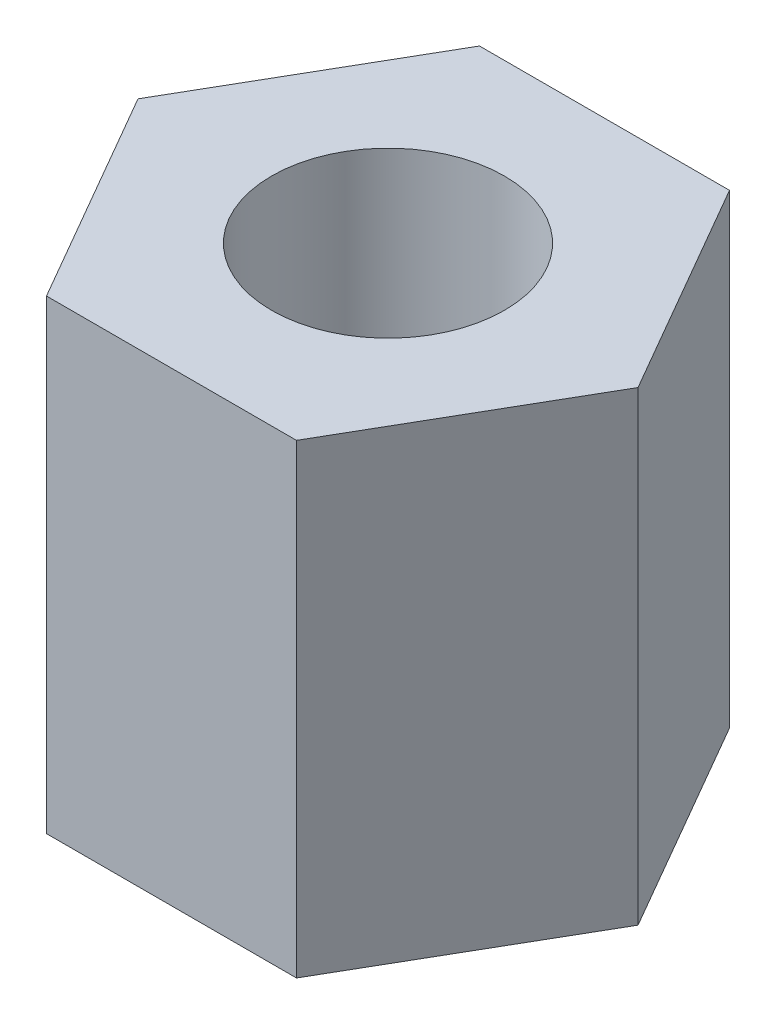
ISO-10303-21;
HEADER;
FILE_DESCRIPTION(('STEP AP214'),'2;1');
FILE_NAME('part.step','',(''),(''),'','','');
FILE_SCHEMA(('AUTOMOTIVE_DESIGN { 1 0 10303 214 1 1 1 1 }'));
ENDSEC;
DATA;
#1=APPLICATION_CONTEXT('core data for automotive mechanical design processes');
#2=APPLICATION_PROTOCOL_DEFINITION('international standard','automotive_design',2000,#1);
#3=PRODUCT_CONTEXT('',#1,'mechanical');
#4=PRODUCT('Part','Part','',(#3));
#5=PRODUCT_RELATED_PRODUCT_CATEGORY('part','',(#4));
#6=PRODUCT_DEFINITION_FORMATION('','',#4);
#7=PRODUCT_DEFINITION_CONTEXT('part definition',#1,'design');
#8=PRODUCT_DEFINITION('design','',#6,#7);
#9=PRODUCT_DEFINITION_SHAPE('','',#8);
#10=(LENGTH_UNIT() NAMED_UNIT(*) SI_UNIT(.MILLI.,.METRE.));
#11=(NAMED_UNIT(*) PLANE_ANGLE_UNIT() SI_UNIT($,.RADIAN.));
#12=(NAMED_UNIT(*) SI_UNIT($,.STERADIAN.) SOLID_ANGLE_UNIT());
#13=UNCERTAINTY_MEASURE_WITH_UNIT(LENGTH_MEASURE(1.E-05),#10,'distance_accuracy_value','');
#14=(GEOMETRIC_REPRESENTATION_CONTEXT(3) GLOBAL_UNCERTAINTY_ASSIGNED_CONTEXT((#13)) GLOBAL_UNIT_ASSIGNED_CONTEXT((#10,
#11,#12)) REPRESENTATION_CONTEXT('',''));
#15=CARTESIAN_POINT('',(0.,0.,0.));
#16=DIRECTION('',(0.,0.,1.));
#17=DIRECTION('',(1.,0.,0.));
#18=AXIS2_PLACEMENT_3D('',#15,#16,#17);
#19=CARTESIAN_POINT('',(1.34233937586591,2.5,2.32499999999999));
#20=DIRECTION('',(-0.866025403784442,0.,-0.499999999999995));
#21=DIRECTION('',(-0.499999999999995,0.,0.866025403784442));
#22=AXIS2_PLACEMENT_3D('',#19,#20,#21);
#23=PLANE('',#22);
#24=DIRECTION('',(0.499999999999995,0.,-0.866025403784442));
#25=VECTOR('',#24,1.);
#26=CARTESIAN_POINT('',(1.34233937586591,-2.5,2.32499999999999));
#27=LINE('',#26,#25);
#28=CARTESIAN_POINT('',(1.34233937586591,-2.5,2.32499999999999));
#29=VERTEX_POINT('',#28);
#30=CARTESIAN_POINT('',(2.68467875173176,-2.5,0.));
#31=VERTEX_POINT('',#30);
#32=EDGE_CURVE('E120',#29,#31,#27,.T.);
#33=ORIENTED_EDGE('',*,*,#32,.T.);
#34=DIRECTION('',(0.,-1.,0.));
#35=VECTOR('',#34,1.);
#36=CARTESIAN_POINT('',(2.68467875173176,2.5,0.));
#37=LINE('',#36,#35);
#38=CARTESIAN_POINT('',(2.68467875173176,2.5,0.));
#39=VERTEX_POINT('',#38);
#40=EDGE_CURVE('E11',#39,#31,#37,.T.);
#41=ORIENTED_EDGE('',*,*,#40,.F.);
#42=DIRECTION('',(0.499999999999995,0.,-0.866025403784442));
#43=VECTOR('',#42,1.);
#44=CARTESIAN_POINT('',(1.34233937586591,2.5,2.32499999999999));
#45=LINE('',#44,#43);
#46=CARTESIAN_POINT('',(1.34233937586591,2.5,2.32499999999999));
#47=VERTEX_POINT('',#46);
#48=EDGE_CURVE('E131',#47,#39,#45,.T.);
#49=ORIENTED_EDGE('',*,*,#48,.F.);
#50=DIRECTION('',(0.,-1.,0.));
#51=VECTOR('',#50,1.);
#52=CARTESIAN_POINT('',(1.34233937586591,2.5,2.32499999999999));
#53=LINE('',#52,#51);
#54=EDGE_CURVE('E116',#47,#29,#53,.T.);
#55=ORIENTED_EDGE('',*,*,#54,.T.);
#56=EDGE_LOOP('',(#33,#41,#49,#55));
#57=FACE_BOUND('',#56,.T.);
#58=ADVANCED_FACE('F36',(#57),#23,.F.);
#59=CARTESIAN_POINT('',(2.68467875173176,2.5,0.));
#60=DIRECTION('',(-0.866025403784438,0.,0.500000000000001));
#61=DIRECTION('',(0.500000000000001,0.,0.866025403784438));
#62=AXIS2_PLACEMENT_3D('',#59,#60,#61);
#63=PLANE('',#62);
#64=DIRECTION('',(-0.500000000000001,0.,-0.866025403784438));
#65=VECTOR('',#64,1.);
#66=CARTESIAN_POINT('',(2.68467875173176,-2.5,0.));
#67=LINE('',#66,#65);
#68=CARTESIAN_POINT('',(1.34233937586588,-2.5,-2.325));
#69=VERTEX_POINT('',#68);
#70=EDGE_CURVE('E123',#31,#69,#67,.T.);
#71=ORIENTED_EDGE('',*,*,#70,.T.);
#72=DIRECTION('',(0.,-1.,0.));
#73=VECTOR('',#72,1.);
#74=CARTESIAN_POINT('',(1.34233937586588,2.5,-2.325));
#75=LINE('',#74,#73);
#76=CARTESIAN_POINT('',(1.34233937586588,2.5,-2.325));
#77=VERTEX_POINT('',#76);
#78=EDGE_CURVE('E44',#77,#69,#75,.T.);
#79=ORIENTED_EDGE('',*,*,#78,.F.);
#80=DIRECTION('',(-0.500000000000001,0.,-0.866025403784438));
#81=VECTOR('',#80,1.);
#82=CARTESIAN_POINT('',(2.68467875173176,2.5,0.));
#83=LINE('',#82,#81);
#84=EDGE_CURVE('E89',#39,#77,#83,.T.);
#85=ORIENTED_EDGE('',*,*,#84,.F.);
#86=ORIENTED_EDGE('',*,*,#40,.T.);
#87=EDGE_LOOP('',(#71,#79,#85,#86));
#88=FACE_BOUND('',#87,.T.);
#89=ADVANCED_FACE('F156',(#88),#63,.F.);
#90=CARTESIAN_POINT('',(1.34233937586588,2.5,-2.325));
#91=DIRECTION('',(0.,0.,1.));
#92=DIRECTION('',(1.,0.,0.));
#93=AXIS2_PLACEMENT_3D('',#90,#91,#92);
#94=PLANE('',#93);
#95=DIRECTION('',(-1.,0.,0.));
#96=VECTOR('',#95,1.);
#97=CARTESIAN_POINT('',(1.34233937586588,-2.5,-2.325));
#98=LINE('',#97,#96);
#99=CARTESIAN_POINT('',(-1.34233937586589,-2.5,-2.32499999999999));
#100=VERTEX_POINT('',#99);
#101=EDGE_CURVE('E126',#69,#100,#98,.T.);
#102=ORIENTED_EDGE('',*,*,#101,.T.);
#103=DIRECTION('',(0.,-1.,0.));
#104=VECTOR('',#103,1.);
#105=CARTESIAN_POINT('',(-1.34233937586589,2.5,-2.32499999999999));
#106=LINE('',#105,#104);
#107=CARTESIAN_POINT('',(-1.34233937586589,2.5,-2.32499999999999));
#108=VERTEX_POINT('',#107);
#109=EDGE_CURVE('E111',#108,#100,#106,.T.);
#110=ORIENTED_EDGE('',*,*,#109,.F.);
#111=DIRECTION('',(-1.,0.,0.));
#112=VECTOR('',#111,1.);
#113=CARTESIAN_POINT('',(1.34233937586588,2.5,-2.325));
#114=LINE('',#113,#112);
#115=EDGE_CURVE('E102',#77,#108,#114,.T.);
#116=ORIENTED_EDGE('',*,*,#115,.F.);
#117=ORIENTED_EDGE('',*,*,#78,.T.);
#118=EDGE_LOOP('',(#102,#110,#116,#117));
#119=FACE_BOUND('',#118,.T.);
#120=ADVANCED_FACE('F137',(#119),#94,.F.);
#121=CARTESIAN_POINT('',(-1.34233937586589,2.5,-2.32499999999999));
#122=DIRECTION('',(0.866025403784441,0.,0.499999999999995));
#123=DIRECTION('',(0.499999999999995,0.,-0.866025403784441));
#124=AXIS2_PLACEMENT_3D('',#121,#122,#123);
#125=PLANE('',#124);
#126=DIRECTION('',(-0.499999999999995,0.,0.866025403784441));
#127=VECTOR('',#126,1.);
#128=CARTESIAN_POINT('',(-1.34233937586589,-2.5,-2.32499999999999));
#129=LINE('',#128,#127);
#130=CARTESIAN_POINT('',(-2.68467875173176,-2.5,0.));
#131=VERTEX_POINT('',#130);
#132=EDGE_CURVE('E110',#100,#131,#129,.T.);
#133=ORIENTED_EDGE('',*,*,#132,.T.);
#134=DIRECTION('',(0.,-1.,0.));
#135=VECTOR('',#134,1.);
#136=CARTESIAN_POINT('',(-2.68467875173176,2.5,0.));
#137=LINE('',#136,#135);
#138=CARTESIAN_POINT('',(-2.68467875173176,2.5,0.));
#139=VERTEX_POINT('',#138);
#140=EDGE_CURVE('E107',#139,#131,#137,.T.);
#141=ORIENTED_EDGE('',*,*,#140,.F.);
#142=DIRECTION('',(-0.499999999999995,0.,0.866025403784441));
#143=VECTOR('',#142,1.);
#144=CARTESIAN_POINT('',(-1.34233937586589,2.5,-2.32499999999999));
#145=LINE('',#144,#143);
#146=EDGE_CURVE('E96',#108,#139,#145,.T.);
#147=ORIENTED_EDGE('',*,*,#146,.F.);
#148=ORIENTED_EDGE('',*,*,#109,.T.);
#149=EDGE_LOOP('',(#133,#141,#147,#148));
#150=FACE_BOUND('',#149,.T.);
#151=ADVANCED_FACE('F108',(#150),#125,.F.);
#152=CARTESIAN_POINT('',(-2.68467875173176,2.5,0.));
#153=DIRECTION('',(0.866025403784434,0.,-0.500000000000007));
#154=DIRECTION('',(-0.500000000000007,0.,-0.866025403784435));
#155=AXIS2_PLACEMENT_3D('',#152,#153,#154);
#156=PLANE('',#155);
#157=DIRECTION('',(0.500000000000007,0.,0.866025403784434));
#158=VECTOR('',#157,1.);
#159=CARTESIAN_POINT('',(-2.68467875173176,-2.5,0.));
#160=LINE('',#159,#158);
#161=CARTESIAN_POINT('',(-1.34233937586586,-2.5,2.32500000000001));
#162=VERTEX_POINT('',#161);
#163=EDGE_CURVE('E75',#131,#162,#160,.T.);
#164=ORIENTED_EDGE('',*,*,#163,.T.);
#165=DIRECTION('',(0.,-1.,0.));
#166=VECTOR('',#165,1.);
#167=CARTESIAN_POINT('',(-1.34233937586586,2.5,2.32500000000001));
#168=LINE('',#167,#166);
#169=CARTESIAN_POINT('',(-1.34233937586586,2.5,2.32500000000001));
#170=VERTEX_POINT('',#169);
#171=EDGE_CURVE('E112',#170,#162,#168,.T.);
#172=ORIENTED_EDGE('',*,*,#171,.F.);
#173=DIRECTION('',(0.500000000000007,0.,0.866025403784434));
#174=VECTOR('',#173,1.);
#175=CARTESIAN_POINT('',(-2.68467875173176,2.5,0.));
#176=LINE('',#175,#174);
#177=EDGE_CURVE('E100',#139,#170,#176,.T.);
#178=ORIENTED_EDGE('',*,*,#177,.F.);
#179=ORIENTED_EDGE('',*,*,#140,.T.);
#180=EDGE_LOOP('',(#164,#172,#178,#179));
#181=FACE_BOUND('',#180,.T.);
#182=ADVANCED_FACE('F114',(#181),#156,.F.);
#183=CARTESIAN_POINT('',(-1.34233937586586,2.5,2.32500000000001));
#184=DIRECTION('',(0.,0.,-1.));
#185=DIRECTION('',(-1.,0.,0.));
#186=AXIS2_PLACEMENT_3D('',#183,#184,#185);
#187=PLANE('',#186);
#188=DIRECTION('',(1.,0.,0.));
#189=VECTOR('',#188,1.);
#190=CARTESIAN_POINT('',(-1.34233937586586,-2.5,2.32500000000001));
#191=LINE('',#190,#189);
#192=EDGE_CURVE('E81',#162,#29,#191,.T.);
#193=ORIENTED_EDGE('',*,*,#192,.T.);
#194=ORIENTED_EDGE('',*,*,#54,.F.);
#195=DIRECTION('',(1.,0.,0.));
#196=VECTOR('',#195,1.);
#197=CARTESIAN_POINT('',(-1.34233937586586,2.5,2.32500000000001));
#198=LINE('',#197,#196);
#199=EDGE_CURVE('E52',#170,#47,#198,.T.);
#200=ORIENTED_EDGE('',*,*,#199,.F.);
#201=ORIENTED_EDGE('',*,*,#171,.T.);
#202=EDGE_LOOP('',(#193,#194,#200,#201));
#203=FACE_BOUND('',#202,.T.);
#204=ADVANCED_FACE('F144',(#203),#187,.F.);
#205=CARTESIAN_POINT('',(0.,2.5,0.));
#206=DIRECTION('',(0.,1.,0.));
#207=DIRECTION('',(0.,0.,1.));
#208=AXIS2_PLACEMENT_3D('',#205,#206,#207);
#209=PLANE('',#208);
#210=CARTESIAN_POINT('',(0.,2.5,0.));
#211=DIRECTION('',(0.,1.,0.));
#212=DIRECTION('',(0.,0.,1.));
#213=AXIS2_PLACEMENT_3D('',#210,#211,#212);
#214=CIRCLE('',#213,1.24999999999999);
#215=CARTESIAN_POINT('',(0.,2.5,1.24999999999999));
#216=VERTEX_POINT('',#215);
#217=EDGE_CURVE('E124',#216,#216,#214,.T.);
#218=ORIENTED_EDGE('',*,*,#217,.F.);
#219=EDGE_LOOP('',(#218));
#220=FACE_BOUND('',#219,.T.);
#221=ORIENTED_EDGE('',*,*,#48,.T.);
#222=ORIENTED_EDGE('',*,*,#84,.T.);
#223=ORIENTED_EDGE('',*,*,#115,.T.);
#224=ORIENTED_EDGE('',*,*,#146,.T.);
#225=ORIENTED_EDGE('',*,*,#177,.T.);
#226=ORIENTED_EDGE('',*,*,#199,.T.);
#227=EDGE_LOOP('',(#221,#222,#223,#224,#225,#226));
#228=FACE_BOUND('',#227,.T.);
#229=ADVANCED_FACE('F98',(#220,#228),#209,.T.);
#230=CARTESIAN_POINT('',(0.,-2.5,0.));
#231=DIRECTION('',(0.,1.,0.));
#232=DIRECTION('',(0.,0.,1.));
#233=AXIS2_PLACEMENT_3D('',#230,#231,#232);
#234=PLANE('',#233);
#235=CARTESIAN_POINT('',(0.,-2.5,0.));
#236=DIRECTION('',(0.,-1.,0.));
#237=DIRECTION('',(0.,0.,-1.));
#238=AXIS2_PLACEMENT_3D('',#235,#236,#237);
#239=CIRCLE('',#238,1.24999999999999);
#240=CARTESIAN_POINT('',(0.,-2.5,-1.24999999999999));
#241=VERTEX_POINT('',#240);
#242=EDGE_CURVE('E213',#241,#241,#239,.T.);
#243=ORIENTED_EDGE('',*,*,#242,.F.);
#244=EDGE_LOOP('',(#243));
#245=FACE_BOUND('',#244,.T.);
#246=ORIENTED_EDGE('',*,*,#32,.F.);
#247=ORIENTED_EDGE('',*,*,#192,.F.);
#248=ORIENTED_EDGE('',*,*,#163,.F.);
#249=ORIENTED_EDGE('',*,*,#132,.F.);
#250=ORIENTED_EDGE('',*,*,#101,.F.);
#251=ORIENTED_EDGE('',*,*,#70,.F.);
#252=EDGE_LOOP('',(#246,#247,#248,#249,#250,#251));
#253=FACE_BOUND('',#252,.T.);
#254=ADVANCED_FACE('F140',(#245,#253),#234,.F.);
#255=CARTESIAN_POINT('',(0.,-2.5,0.));
#256=DIRECTION('',(0.,-1.,0.));
#257=DIRECTION('',(0.,0.,-1.));
#258=AXIS2_PLACEMENT_3D('',#255,#256,#257);
#259=CYLINDRICAL_SURFACE('',#258,1.24999999999999);
#260=ORIENTED_EDGE('',*,*,#217,.T.);
#261=EDGE_LOOP('',(#260));
#262=FACE_BOUND('',#261,.T.);
#263=ORIENTED_EDGE('',*,*,#242,.T.);
#264=EDGE_LOOP('',(#263));
#265=FACE_BOUND('',#264,.T.);
#266=ADVANCED_FACE('F193',(#262,#265),#259,.F.);
#267=CLOSED_SHELL('',(#58,#89,#120,#151,#182,#204,#229,#254,#266));
#268=MANIFOLD_SOLID_BREP('B2',#267);
#269=ADVANCED_BREP_SHAPE_REPRESENTATION('',(#18,#268),#14);
#270=SHAPE_DEFINITION_REPRESENTATION(#9,#269);
ENDSEC;
END-ISO-10303-21;
